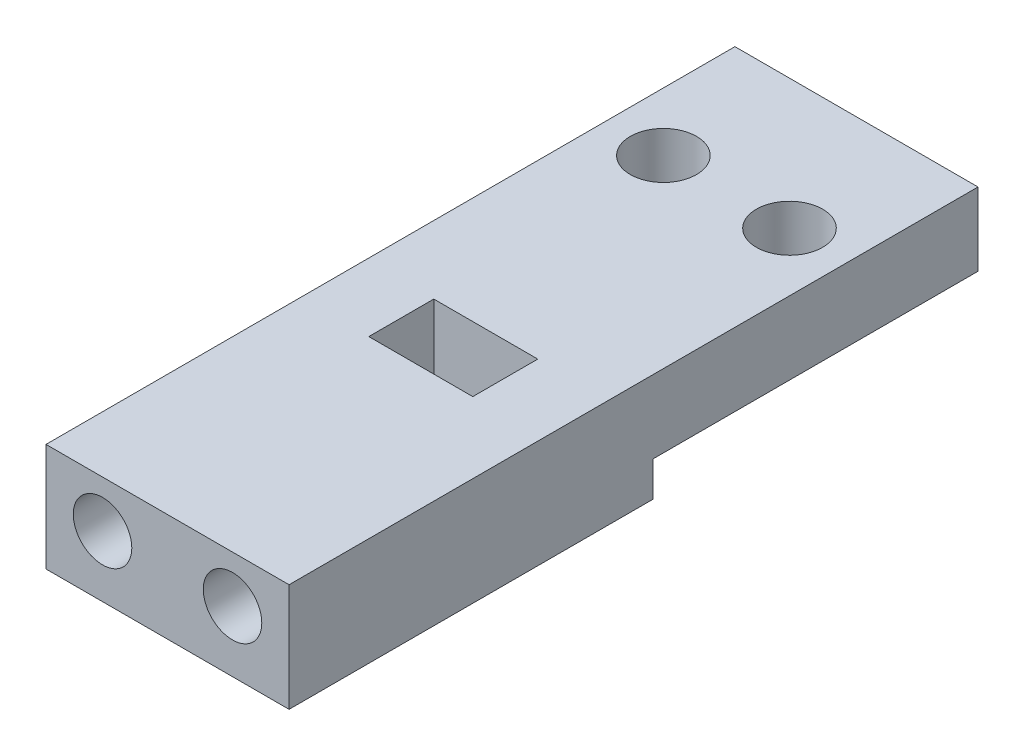
ISO-10303-21;
HEADER;
FILE_DESCRIPTION(('STEP AP214'),'2;1');
FILE_NAME('part.step','',(''),(''),'','','');
FILE_SCHEMA(('AUTOMOTIVE_DESIGN { 1 0 10303 214 1 1 1 1 }'));
ENDSEC;
DATA;
#1=APPLICATION_CONTEXT('core data for automotive mechanical design processes');
#2=APPLICATION_PROTOCOL_DEFINITION('international standard','automotive_design',2000,#1);
#3=PRODUCT_CONTEXT('',#1,'mechanical');
#4=PRODUCT('Part','Part','',(#3));
#5=PRODUCT_RELATED_PRODUCT_CATEGORY('part','',(#4));
#6=PRODUCT_DEFINITION_FORMATION('','',#4);
#7=PRODUCT_DEFINITION_CONTEXT('part definition',#1,'design');
#8=PRODUCT_DEFINITION('design','',#6,#7);
#9=PRODUCT_DEFINITION_SHAPE('','',#8);
#10=(LENGTH_UNIT() NAMED_UNIT(*) SI_UNIT(.MILLI.,.METRE.));
#11=(NAMED_UNIT(*) PLANE_ANGLE_UNIT() SI_UNIT($,.RADIAN.));
#12=(NAMED_UNIT(*) SI_UNIT($,.STERADIAN.) SOLID_ANGLE_UNIT());
#13=UNCERTAINTY_MEASURE_WITH_UNIT(LENGTH_MEASURE(1.E-05),#10,'distance_accuracy_value','');
#14=(GEOMETRIC_REPRESENTATION_CONTEXT(3) GLOBAL_UNCERTAINTY_ASSIGNED_CONTEXT((#13)) GLOBAL_UNIT_ASSIGNED_CONTEXT((#10,
#11,#12)) REPRESENTATION_CONTEXT('',''));
#15=CARTESIAN_POINT('',(0.,0.,0.));
#16=DIRECTION('',(0.,0.,1.));
#17=DIRECTION('',(1.,0.,0.));
#18=AXIS2_PLACEMENT_3D('',#15,#16,#17);
#19=CARTESIAN_POINT('',(-11.1666666666667,-5.,30.));
#20=DIRECTION('',(0.,1.,0.));
#21=DIRECTION('',(0.,0.,1.));
#22=AXIS2_PLACEMENT_3D('',#19,#20,#21);
#23=PLANE('',#22);
#24=DIRECTION('',(-1.,0.,0.));
#25=VECTOR('',#24,1.);
#26=CARTESIAN_POINT('',(-4.,-5.,5.4));
#27=LINE('',#26,#25);
#28=CARTESIAN_POINT('',(4.,-5.,5.4));
#29=VERTEX_POINT('',#28);
#30=CARTESIAN_POINT('',(-4.,-5.,5.4));
#31=VERTEX_POINT('',#30);
#32=EDGE_CURVE('E132',#29,#31,#27,.T.);
#33=ORIENTED_EDGE('',*,*,#32,.T.);
#34=DIRECTION('',(0.,0.,1.));
#35=VECTOR('',#34,1.);
#36=CARTESIAN_POINT('',(-4.,-5.,5.4));
#37=LINE('',#36,#35);
#38=CARTESIAN_POINT('',(-4.,-5.,10.4));
#39=VERTEX_POINT('',#38);
#40=EDGE_CURVE('E125',#31,#39,#37,.T.);
#41=ORIENTED_EDGE('',*,*,#40,.T.);
#42=DIRECTION('',(1.,0.,0.));
#43=VECTOR('',#42,1.);
#44=CARTESIAN_POINT('',(-4.,-5.,10.4));
#45=LINE('',#44,#43);
#46=CARTESIAN_POINT('',(4.,-5.,10.4));
#47=VERTEX_POINT('',#46);
#48=EDGE_CURVE('E135',#39,#47,#45,.T.);
#49=ORIENTED_EDGE('',*,*,#48,.T.);
#50=DIRECTION('',(0.,0.,-1.));
#51=VECTOR('',#50,1.);
#52=CARTESIAN_POINT('',(4.,-5.,5.4));
#53=LINE('',#52,#51);
#54=EDGE_CURVE('E61',#47,#29,#53,.T.);
#55=ORIENTED_EDGE('',*,*,#54,.T.);
#56=EDGE_LOOP('',(#33,#41,#49,#55));
#57=FACE_BOUND('',#56,.T.);
#58=DIRECTION('',(0.,0.,1.));
#59=VECTOR('',#58,1.);
#60=CARTESIAN_POINT('',(-9.23333333333332,-5.,30.));
#61=LINE('',#60,#59);
#62=CARTESIAN_POINT('',(-9.23333333333332,-5.,2.));
#63=VERTEX_POINT('',#62);
#64=CARTESIAN_POINT('',(-9.23333333333332,-5.,30.));
#65=VERTEX_POINT('',#64);
#66=EDGE_CURVE('E246',#63,#65,#61,.T.);
#67=ORIENTED_EDGE('',*,*,#66,.F.);
#68=DIRECTION('',(1.,0.,0.));
#69=VECTOR('',#68,1.);
#70=CARTESIAN_POINT('',(-9.23333333333332,-5.,2.));
#71=LINE('',#70,#69);
#72=CARTESIAN_POINT('',(9.46666666666667,-5.,2.));
#73=VERTEX_POINT('',#72);
#74=EDGE_CURVE('E218',#63,#73,#71,.T.);
#75=ORIENTED_EDGE('',*,*,#74,.T.);
#76=DIRECTION('',(0.,0.,-1.));
#77=VECTOR('',#76,1.);
#78=CARTESIAN_POINT('',(9.46666666666667,-5.,30.));
#79=LINE('',#78,#77);
#80=CARTESIAN_POINT('',(9.46666666666667,-5.,30.));
#81=VERTEX_POINT('',#80);
#82=EDGE_CURVE('E240',#81,#73,#79,.T.);
#83=ORIENTED_EDGE('',*,*,#82,.F.);
#84=DIRECTION('',(1.,0.,0.));
#85=VECTOR('',#84,1.);
#86=CARTESIAN_POINT('',(-11.1666666666667,-5.,30.));
#87=LINE('',#86,#85);
#88=EDGE_CURVE('E12',#65,#81,#87,.T.);
#89=ORIENTED_EDGE('',*,*,#88,.F.);
#90=EDGE_LOOP('',(#67,#75,#83,#89));
#91=FACE_BOUND('',#90,.T.);
#92=ADVANCED_FACE('F46',(#57,#91),#23,.F.);
#93=CARTESIAN_POINT('',(0.,0.,30.));
#94=DIRECTION('',(0.,0.,-1.));
#95=DIRECTION('',(-1.,0.,0.));
#96=AXIS2_PLACEMENT_3D('',#93,#94,#95);
#97=PLANE('',#96);
#98=CARTESIAN_POINT('',(5.11666666666668,-0.299999999999998,30.));
#99=DIRECTION('',(0.,0.,1.));
#100=DIRECTION('',(1.,0.,0.));
#101=AXIS2_PLACEMENT_3D('',#98,#99,#100);
#102=CIRCLE('',#101,2.25);
#103=CARTESIAN_POINT('',(7.36666666666667,-0.299999999999998,30.));
#104=VERTEX_POINT('',#103);
#105=EDGE_CURVE('E257',#104,#104,#102,.T.);
#106=ORIENTED_EDGE('',*,*,#105,.F.);
#107=EDGE_LOOP('',(#106));
#108=FACE_BOUND('',#107,.T.);
#109=CARTESIAN_POINT('',(-4.88333333333333,-0.299999999999998,30.));
#110=DIRECTION('',(0.,0.,1.));
#111=DIRECTION('',(1.,0.,0.));
#112=AXIS2_PLACEMENT_3D('',#109,#110,#111);
#113=CIRCLE('',#112,2.25);
#114=CARTESIAN_POINT('',(-2.63333333333332,-0.299999999999998,30.));
#115=VERTEX_POINT('',#114);
#116=EDGE_CURVE('E253',#115,#115,#113,.T.);
#117=ORIENTED_EDGE('',*,*,#116,.F.);
#118=EDGE_LOOP('',(#117));
#119=FACE_BOUND('',#118,.T.);
#120=DIRECTION('',(0.,-1.,0.));
#121=VECTOR('',#120,1.);
#122=CARTESIAN_POINT('',(-9.23333333333332,-5.01131400333574,30.));
#123=LINE('',#122,#121);
#124=CARTESIAN_POINT('',(-9.23333333333332,3.30440523355484,30.));
#125=VERTEX_POINT('',#124);
#126=EDGE_CURVE('E222',#125,#65,#123,.T.);
#127=ORIENTED_EDGE('',*,*,#126,.T.);
#128=ORIENTED_EDGE('',*,*,#88,.T.);
#129=DIRECTION('',(0.,1.,0.));
#130=VECTOR('',#129,1.);
#131=CARTESIAN_POINT('',(9.46666666666667,-5.01131400333574,30.));
#132=LINE('',#131,#130);
#133=CARTESIAN_POINT('',(9.46666666666667,3.30440523355484,30.));
#134=VERTEX_POINT('',#133);
#135=EDGE_CURVE('E228',#81,#134,#132,.T.);
#136=ORIENTED_EDGE('',*,*,#135,.T.);
#137=DIRECTION('',(-1.,0.,0.));
#138=VECTOR('',#137,1.);
#139=CARTESIAN_POINT('',(-9.23333333333332,3.30440523355484,30.));
#140=LINE('',#139,#138);
#141=EDGE_CURVE('E232',#134,#125,#140,.T.);
#142=ORIENTED_EDGE('',*,*,#141,.T.);
#143=EDGE_LOOP('',(#127,#128,#136,#142));
#144=FACE_BOUND('',#143,.T.);
#145=ADVANCED_FACE('F269',(#108,#119,#144),#97,.F.);
#146=CARTESIAN_POINT('',(5.11666666666668,-0.299999999999998,15.));
#147=DIRECTION('',(0.,0.,1.));
#148=DIRECTION('',(1.,0.,0.));
#149=AXIS2_PLACEMENT_3D('',#146,#147,#148);
#150=CYLINDRICAL_SURFACE('',#149,2.25);
#151=CARTESIAN_POINT('',(5.11666666666668,-0.299999999999998,15.));
#152=DIRECTION('',(0.,0.,1.));
#153=DIRECTION('',(1.,0.,0.));
#154=AXIS2_PLACEMENT_3D('',#151,#152,#153);
#155=CIRCLE('',#154,2.25);
#156=CARTESIAN_POINT('',(7.36666666666667,-0.299999999999998,15.));
#157=VERTEX_POINT('',#156);
#158=EDGE_CURVE('E249',#157,#157,#155,.T.);
#159=ORIENTED_EDGE('',*,*,#158,.F.);
#160=EDGE_LOOP('',(#159));
#161=FACE_BOUND('',#160,.T.);
#162=ORIENTED_EDGE('',*,*,#105,.T.);
#163=EDGE_LOOP('',(#162));
#164=FACE_BOUND('',#163,.T.);
#165=ADVANCED_FACE('F266',(#161,#164),#150,.F.);
#166=CARTESIAN_POINT('',(5.11666666666668,-0.299999999999998,15.));
#167=DIRECTION('',(0.,0.,1.));
#168=DIRECTION('',(1.,0.,0.));
#169=AXIS2_PLACEMENT_3D('',#166,#167,#168);
#170=PLANE('',#169);
#171=ORIENTED_EDGE('',*,*,#158,.T.);
#172=EDGE_LOOP('',(#171));
#173=FACE_BOUND('',#172,.T.);
#174=ADVANCED_FACE('F264',(#173),#170,.T.);
#175=CARTESIAN_POINT('',(-4.88333333333333,-0.299999999999998,15.));
#176=DIRECTION('',(0.,0.,1.));
#177=DIRECTION('',(1.,0.,0.));
#178=AXIS2_PLACEMENT_3D('',#175,#176,#177);
#179=CYLINDRICAL_SURFACE('',#178,2.25);
#180=CARTESIAN_POINT('',(-4.88333333333333,-0.299999999999998,15.));
#181=DIRECTION('',(0.,0.,1.));
#182=DIRECTION('',(1.,0.,0.));
#183=AXIS2_PLACEMENT_3D('',#180,#181,#182);
#184=CIRCLE('',#183,2.25);
#185=CARTESIAN_POINT('',(-2.63333333333332,-0.299999999999998,15.));
#186=VERTEX_POINT('',#185);
#187=EDGE_CURVE('E54',#186,#186,#184,.T.);
#188=ORIENTED_EDGE('',*,*,#187,.F.);
#189=EDGE_LOOP('',(#188));
#190=FACE_BOUND('',#189,.T.);
#191=ORIENTED_EDGE('',*,*,#116,.T.);
#192=EDGE_LOOP('',(#191));
#193=FACE_BOUND('',#192,.T.);
#194=ADVANCED_FACE('F332',(#190,#193),#179,.F.);
#195=CARTESIAN_POINT('',(0.,0.,15.));
#196=DIRECTION('',(0.,0.,1.));
#197=DIRECTION('',(1.,0.,0.));
#198=AXIS2_PLACEMENT_3D('',#195,#196,#197);
#199=PLANE('',#198);
#200=ORIENTED_EDGE('',*,*,#187,.T.);
#201=EDGE_LOOP('',(#200));
#202=FACE_BOUND('',#201,.T.);
#203=ADVANCED_FACE('F339',(#202),#199,.T.);
#204=CARTESIAN_POINT('',(-9.23333333333332,-5.01131400333574,0.));
#205=DIRECTION('',(-1.,0.,0.));
#206=DIRECTION('',(0.,0.,1.));
#207=AXIS2_PLACEMENT_3D('',#204,#205,#206);
#208=PLANE('',#207);
#209=DIRECTION('',(0.,-1.,0.));
#210=VECTOR('',#209,1.);
#211=CARTESIAN_POINT('',(-9.23333333333332,-5.,2.));
#212=LINE('',#211,#210);
#213=CARTESIAN_POINT('',(-9.23333333333332,-2.31295329421103,2.));
#214=VERTEX_POINT('',#213);
#215=EDGE_CURVE('E207',#214,#63,#212,.T.);
#216=ORIENTED_EDGE('',*,*,#215,.T.);
#217=ORIENTED_EDGE('',*,*,#66,.T.);
#218=ORIENTED_EDGE('',*,*,#126,.F.);
#219=DIRECTION('',(0.,0.,1.));
#220=VECTOR('',#219,1.);
#221=CARTESIAN_POINT('',(-9.23333333333332,3.30440523355484,0.));
#222=LINE('',#221,#220);
#223=CARTESIAN_POINT('',(-9.23333333333332,3.30440523355484,-23.0000000000001));
#224=VERTEX_POINT('',#223);
#225=EDGE_CURVE('E237',#224,#125,#222,.T.);
#226=ORIENTED_EDGE('',*,*,#225,.F.);
#227=DIRECTION('',(0.,1.,0.));
#228=VECTOR('',#227,1.);
#229=CARTESIAN_POINT('',(-9.23333333333332,-21.6698642047877,-23.0000000000001));
#230=LINE('',#229,#228);
#231=CARTESIAN_POINT('',(-9.23333333333332,-2.31295329421102,-23.0000000000001));
#232=VERTEX_POINT('',#231);
#233=EDGE_CURVE('E175',#232,#224,#230,.T.);
#234=ORIENTED_EDGE('',*,*,#233,.F.);
#235=DIRECTION('',(0.,0.,1.));
#236=VECTOR('',#235,1.);
#237=CARTESIAN_POINT('',(-9.23333333333332,-2.31295329421102,-18.));
#238=LINE('',#237,#236);
#239=EDGE_CURVE('E203',#232,#214,#238,.T.);
#240=ORIENTED_EDGE('',*,*,#239,.T.);
#241=EDGE_LOOP('',(#216,#217,#218,#226,#234,#240));
#242=FACE_BOUND('',#241,.T.);
#243=ADVANCED_FACE('F291',(#242),#208,.T.);
#244=CARTESIAN_POINT('',(9.46666666666667,-5.01131400333574,0.));
#245=DIRECTION('',(1.,0.,0.));
#246=DIRECTION('',(0.,0.,-1.));
#247=AXIS2_PLACEMENT_3D('',#244,#245,#246);
#248=PLANE('',#247);
#249=DIRECTION('',(0.,-1.,0.));
#250=VECTOR('',#249,1.);
#251=CARTESIAN_POINT('',(9.46666666666667,-5.,2.));
#252=LINE('',#251,#250);
#253=CARTESIAN_POINT('',(9.46666666666667,-2.31295329421103,2.));
#254=VERTEX_POINT('',#253);
#255=EDGE_CURVE('E208',#254,#73,#252,.T.);
#256=ORIENTED_EDGE('',*,*,#255,.F.);
#257=DIRECTION('',(0.,0.,1.));
#258=VECTOR('',#257,1.);
#259=CARTESIAN_POINT('',(9.46666666666667,-2.31295329421102,-18.));
#260=LINE('',#259,#258);
#261=CARTESIAN_POINT('',(9.46666666666667,-2.31295329421102,-23.0000000000001));
#262=VERTEX_POINT('',#261);
#263=EDGE_CURVE('E191',#262,#254,#260,.T.);
#264=ORIENTED_EDGE('',*,*,#263,.F.);
#265=DIRECTION('',(0.,1.,0.));
#266=VECTOR('',#265,1.);
#267=CARTESIAN_POINT('',(9.46666666666667,-21.6698642047877,-23.0000000000001));
#268=LINE('',#267,#266);
#269=CARTESIAN_POINT('',(9.46666666666667,3.30440523355484,-23.0000000000001));
#270=VERTEX_POINT('',#269);
#271=EDGE_CURVE('E174',#262,#270,#268,.T.);
#272=ORIENTED_EDGE('',*,*,#271,.T.);
#273=DIRECTION('',(0.,0.,1.));
#274=VECTOR('',#273,1.);
#275=CARTESIAN_POINT('',(9.46666666666667,3.30440523355484,0.));
#276=LINE('',#275,#274);
#277=EDGE_CURVE('E236',#270,#134,#276,.T.);
#278=ORIENTED_EDGE('',*,*,#277,.T.);
#279=ORIENTED_EDGE('',*,*,#135,.F.);
#280=ORIENTED_EDGE('',*,*,#82,.T.);
#281=EDGE_LOOP('',(#256,#264,#272,#278,#279,#280));
#282=FACE_BOUND('',#281,.T.);
#283=ADVANCED_FACE('F285',(#282),#248,.T.);
#284=CARTESIAN_POINT('',(-9.23333333333332,3.30440523355484,0.));
#285=DIRECTION('',(0.,1.,0.));
#286=DIRECTION('',(0.,0.,1.));
#287=AXIS2_PLACEMENT_3D('',#284,#285,#286);
#288=PLANE('',#287);
#289=DIRECTION('',(0.,0.,1.));
#290=VECTOR('',#289,1.);
#291=CARTESIAN_POINT('',(-4.,3.30440523355484,5.4));
#292=LINE('',#291,#290);
#293=CARTESIAN_POINT('',(-4.,3.30440523355484,5.4));
#294=VERTEX_POINT('',#293);
#295=CARTESIAN_POINT('',(-4.,3.30440523355484,10.4));
#296=VERTEX_POINT('',#295);
#297=EDGE_CURVE('E69',#294,#296,#292,.T.);
#298=ORIENTED_EDGE('',*,*,#297,.F.);
#299=DIRECTION('',(-1.,0.,0.));
#300=VECTOR('',#299,1.);
#301=CARTESIAN_POINT('',(-4.,3.30440523355484,5.4));
#302=LINE('',#301,#300);
#303=CARTESIAN_POINT('',(4.,3.30440523355484,5.4));
#304=VERTEX_POINT('',#303);
#305=EDGE_CURVE('E143',#304,#294,#302,.T.);
#306=ORIENTED_EDGE('',*,*,#305,.F.);
#307=DIRECTION('',(0.,0.,-1.));
#308=VECTOR('',#307,1.);
#309=CARTESIAN_POINT('',(4.,3.30440523355484,5.4));
#310=LINE('',#309,#308);
#311=CARTESIAN_POINT('',(4.,3.30440523355484,10.4));
#312=VERTEX_POINT('',#311);
#313=EDGE_CURVE('E147',#312,#304,#310,.T.);
#314=ORIENTED_EDGE('',*,*,#313,.F.);
#315=DIRECTION('',(1.,0.,0.));
#316=VECTOR('',#315,1.);
#317=CARTESIAN_POINT('',(-4.,3.30440523355484,10.4));
#318=LINE('',#317,#316);
#319=EDGE_CURVE('E156',#296,#312,#318,.T.);
#320=ORIENTED_EDGE('',*,*,#319,.F.);
#321=EDGE_LOOP('',(#298,#306,#314,#320));
#322=FACE_BOUND('',#321,.T.);
#323=CARTESIAN_POINT('',(-4.73333333333332,3.30440523355486,-12.9981396600869));
#324=DIRECTION('',(0.,-1.,0.));
#325=DIRECTION('',(0.,0.,-1.));
#326=AXIS2_PLACEMENT_3D('',#323,#324,#325);
#327=CIRCLE('',#326,2.54813966008931);
#328=CARTESIAN_POINT('',(-4.73333333333332,3.30440523355486,-15.5462793201762));
#329=VERTEX_POINT('',#328);
#330=EDGE_CURVE('E187',#329,#329,#327,.T.);
#331=ORIENTED_EDGE('',*,*,#330,.T.);
#332=EDGE_LOOP('',(#331));
#333=FACE_BOUND('',#332,.T.);
#334=CARTESIAN_POINT('',(4.96666666666667,3.30440523355486,-12.9981396600869));
#335=DIRECTION('',(0.,-1.,0.));
#336=DIRECTION('',(0.,0.,-1.));
#337=AXIS2_PLACEMENT_3D('',#334,#335,#336);
#338=CIRCLE('',#337,2.54813966008931);
#339=CARTESIAN_POINT('',(4.96666666666667,3.30440523355486,-15.5462793201762));
#340=VERTEX_POINT('',#339);
#341=EDGE_CURVE('E196',#340,#340,#338,.T.);
#342=ORIENTED_EDGE('',*,*,#341,.T.);
#343=EDGE_LOOP('',(#342));
#344=FACE_BOUND('',#343,.T.);
#345=ORIENTED_EDGE('',*,*,#141,.F.);
#346=ORIENTED_EDGE('',*,*,#277,.F.);
#347=DIRECTION('',(-1.,0.,0.));
#348=VECTOR('',#347,1.);
#349=CARTESIAN_POINT('',(9.46666666666667,3.30440523355484,-23.0000000000001));
#350=LINE('',#349,#348);
#351=EDGE_CURVE('E165',#270,#224,#350,.T.);
#352=ORIENTED_EDGE('',*,*,#351,.T.);
#353=ORIENTED_EDGE('',*,*,#225,.T.);
#354=EDGE_LOOP('',(#345,#346,#352,#353));
#355=FACE_BOUND('',#354,.T.);
#356=ADVANCED_FACE('F289',(#322,#333,#344,#355),#288,.T.);
#357=CARTESIAN_POINT('',(-9.23333333333332,-5.,2.));
#358=DIRECTION('',(0.,0.,1.));
#359=DIRECTION('',(1.,0.,0.));
#360=AXIS2_PLACEMENT_3D('',#357,#358,#359);
#361=PLANE('',#360);
#362=ORIENTED_EDGE('',*,*,#255,.T.);
#363=ORIENTED_EDGE('',*,*,#74,.F.);
#364=ORIENTED_EDGE('',*,*,#215,.F.);
#365=DIRECTION('',(1.,0.,0.));
#366=VECTOR('',#365,1.);
#367=CARTESIAN_POINT('',(-9.23333333333332,-2.31295329421103,2.));
#368=LINE('',#367,#366);
#369=EDGE_CURVE('E212',#214,#254,#368,.T.);
#370=ORIENTED_EDGE('',*,*,#369,.T.);
#371=EDGE_LOOP('',(#362,#363,#364,#370));
#372=FACE_BOUND('',#371,.T.);
#373=ADVANCED_FACE('F299',(#372),#361,.F.);
#374=CARTESIAN_POINT('',(-9.23333333333332,-2.31295329421102,-18.));
#375=DIRECTION('',(0.,1.,0.));
#376=DIRECTION('',(0.,0.,1.));
#377=AXIS2_PLACEMENT_3D('',#374,#375,#376);
#378=PLANE('',#377);
#379=CARTESIAN_POINT('',(-4.73333333333332,-2.31295329421102,-12.9981396600869));
#380=DIRECTION('',(0.,-1.,0.));
#381=DIRECTION('',(0.,0.,-1.));
#382=AXIS2_PLACEMENT_3D('',#379,#380,#381);
#383=CIRCLE('',#382,2.54813966008931);
#384=CARTESIAN_POINT('',(-4.73333333333332,-2.31295329421102,-15.5462793201762));
#385=VERTEX_POINT('',#384);
#386=EDGE_CURVE('E192',#385,#385,#383,.T.);
#387=ORIENTED_EDGE('',*,*,#386,.F.);
#388=EDGE_LOOP('',(#387));
#389=FACE_BOUND('',#388,.T.);
#390=CARTESIAN_POINT('',(4.96666666666667,-2.31295329421102,-12.9981396600869));
#391=DIRECTION('',(0.,-1.,0.));
#392=DIRECTION('',(0.,0.,-1.));
#393=AXIS2_PLACEMENT_3D('',#390,#391,#392);
#394=CIRCLE('',#393,2.54813966008931);
#395=CARTESIAN_POINT('',(4.96666666666667,-2.31295329421102,-15.5462793201762));
#396=VERTEX_POINT('',#395);
#397=EDGE_CURVE('E186',#396,#396,#394,.T.);
#398=ORIENTED_EDGE('',*,*,#397,.F.);
#399=EDGE_LOOP('',(#398));
#400=FACE_BOUND('',#399,.T.);
#401=ORIENTED_EDGE('',*,*,#263,.T.);
#402=ORIENTED_EDGE('',*,*,#369,.F.);
#403=ORIENTED_EDGE('',*,*,#239,.F.);
#404=DIRECTION('',(1.,0.,0.));
#405=VECTOR('',#404,1.);
#406=CARTESIAN_POINT('',(9.46666666666667,-2.31295329421102,-23.0000000000001));
#407=LINE('',#406,#405);
#408=EDGE_CURVE('E179',#232,#262,#407,.T.);
#409=ORIENTED_EDGE('',*,*,#408,.T.);
#410=EDGE_LOOP('',(#401,#402,#403,#409));
#411=FACE_BOUND('',#410,.T.);
#412=ADVANCED_FACE('F296',(#389,#400,#411),#378,.F.);
#413=CARTESIAN_POINT('',(4.96666666666667,3.30440523355486,-12.9981396600869));
#414=DIRECTION('',(0.,-1.,0.));
#415=DIRECTION('',(0.,0.,-1.));
#416=AXIS2_PLACEMENT_3D('',#413,#414,#415);
#417=CYLINDRICAL_SURFACE('',#416,2.54813966008931);
#418=ORIENTED_EDGE('',*,*,#341,.F.);
#419=EDGE_LOOP('',(#418));
#420=FACE_BOUND('',#419,.T.);
#421=ORIENTED_EDGE('',*,*,#397,.T.);
#422=EDGE_LOOP('',(#421));
#423=FACE_BOUND('',#422,.T.);
#424=ADVANCED_FACE('F306',(#420,#423),#417,.F.);
#425=CARTESIAN_POINT('',(-4.73333333333332,3.30440523355486,-12.9981396600869));
#426=DIRECTION('',(0.,-1.,0.));
#427=DIRECTION('',(0.,0.,-1.));
#428=AXIS2_PLACEMENT_3D('',#425,#426,#427);
#429=CYLINDRICAL_SURFACE('',#428,2.54813966008931);
#430=ORIENTED_EDGE('',*,*,#330,.F.);
#431=EDGE_LOOP('',(#430));
#432=FACE_BOUND('',#431,.T.);
#433=ORIENTED_EDGE('',*,*,#386,.T.);
#434=EDGE_LOOP('',(#433));
#435=FACE_BOUND('',#434,.T.);
#436=ADVANCED_FACE('F418',(#432,#435),#429,.F.);
#437=CARTESIAN_POINT('',(9.46666666666667,-21.6698642047877,-23.0000000000001));
#438=DIRECTION('',(0.,0.,-1.));
#439=DIRECTION('',(-1.,0.,0.));
#440=AXIS2_PLACEMENT_3D('',#437,#438,#439);
#441=PLANE('',#440);
#442=ORIENTED_EDGE('',*,*,#408,.F.);
#443=ORIENTED_EDGE('',*,*,#233,.T.);
#444=ORIENTED_EDGE('',*,*,#351,.F.);
#445=ORIENTED_EDGE('',*,*,#271,.F.);
#446=EDGE_LOOP('',(#442,#443,#444,#445));
#447=FACE_BOUND('',#446,.T.);
#448=ADVANCED_FACE('F294',(#447),#441,.T.);
#449=CARTESIAN_POINT('',(-4.,-5.,5.4));
#450=DIRECTION('',(-1.,0.,0.));
#451=DIRECTION('',(0.,0.,1.));
#452=AXIS2_PLACEMENT_3D('',#449,#450,#451);
#453=PLANE('',#452);
#454=ORIENTED_EDGE('',*,*,#297,.T.);
#455=DIRECTION('',(0.,1.,0.));
#456=VECTOR('',#455,1.);
#457=CARTESIAN_POINT('',(-4.,-5.,10.4));
#458=LINE('',#457,#456);
#459=EDGE_CURVE('E121',#39,#296,#458,.T.);
#460=ORIENTED_EDGE('',*,*,#459,.F.);
#461=ORIENTED_EDGE('',*,*,#40,.F.);
#462=DIRECTION('',(0.,1.,0.));
#463=VECTOR('',#462,1.);
#464=CARTESIAN_POINT('',(-4.,-5.,5.4));
#465=LINE('',#464,#463);
#466=EDGE_CURVE('E162',#31,#294,#465,.T.);
#467=ORIENTED_EDGE('',*,*,#466,.T.);
#468=EDGE_LOOP('',(#454,#460,#461,#467));
#469=FACE_BOUND('',#468,.T.);
#470=ADVANCED_FACE('F123',(#469),#453,.F.);
#471=CARTESIAN_POINT('',(-4.,-5.,5.4));
#472=DIRECTION('',(0.,0.,-1.));
#473=DIRECTION('',(-1.,0.,0.));
#474=AXIS2_PLACEMENT_3D('',#471,#472,#473);
#475=PLANE('',#474);
#476=ORIENTED_EDGE('',*,*,#305,.T.);
#477=ORIENTED_EDGE('',*,*,#466,.F.);
#478=ORIENTED_EDGE('',*,*,#32,.F.);
#479=DIRECTION('',(0.,1.,0.));
#480=VECTOR('',#479,1.);
#481=CARTESIAN_POINT('',(4.,-5.,5.4));
#482=LINE('',#481,#480);
#483=EDGE_CURVE('E166',#29,#304,#482,.T.);
#484=ORIENTED_EDGE('',*,*,#483,.T.);
#485=EDGE_LOOP('',(#476,#477,#478,#484));
#486=FACE_BOUND('',#485,.T.);
#487=ADVANCED_FACE('F375',(#486),#475,.F.);
#488=CARTESIAN_POINT('',(4.,-5.,5.4));
#489=DIRECTION('',(1.,0.,0.));
#490=DIRECTION('',(0.,0.,-1.));
#491=AXIS2_PLACEMENT_3D('',#488,#489,#490);
#492=PLANE('',#491);
#493=ORIENTED_EDGE('',*,*,#313,.T.);
#494=ORIENTED_EDGE('',*,*,#483,.F.);
#495=ORIENTED_EDGE('',*,*,#54,.F.);
#496=DIRECTION('',(0.,1.,0.));
#497=VECTOR('',#496,1.);
#498=CARTESIAN_POINT('',(4.,-5.,10.4));
#499=LINE('',#498,#497);
#500=EDGE_CURVE('E131',#47,#312,#499,.T.);
#501=ORIENTED_EDGE('',*,*,#500,.T.);
#502=EDGE_LOOP('',(#493,#494,#495,#501));
#503=FACE_BOUND('',#502,.T.);
#504=ADVANCED_FACE('F387',(#503),#492,.F.);
#505=CARTESIAN_POINT('',(-4.,-5.,10.4));
#506=DIRECTION('',(0.,0.,1.));
#507=DIRECTION('',(1.,0.,0.));
#508=AXIS2_PLACEMENT_3D('',#505,#506,#507);
#509=PLANE('',#508);
#510=ORIENTED_EDGE('',*,*,#319,.T.);
#511=ORIENTED_EDGE('',*,*,#500,.F.);
#512=ORIENTED_EDGE('',*,*,#48,.F.);
#513=ORIENTED_EDGE('',*,*,#459,.T.);
#514=EDGE_LOOP('',(#510,#511,#512,#513));
#515=FACE_BOUND('',#514,.T.);
#516=ADVANCED_FACE('F136',(#515),#509,.F.);
#517=CLOSED_SHELL('',(#92,#145,#165,#174,#194,#203,#243,#283,#356,#373,#412,#424,#436,#448,#470,
#487,#504,#516));
#518=MANIFOLD_SOLID_BREP('B2',#517);
#519=ADVANCED_BREP_SHAPE_REPRESENTATION('',(#18,#518),#14);
#520=SHAPE_DEFINITION_REPRESENTATION(#9,#519);
ENDSEC;
END-ISO-10303-21;
